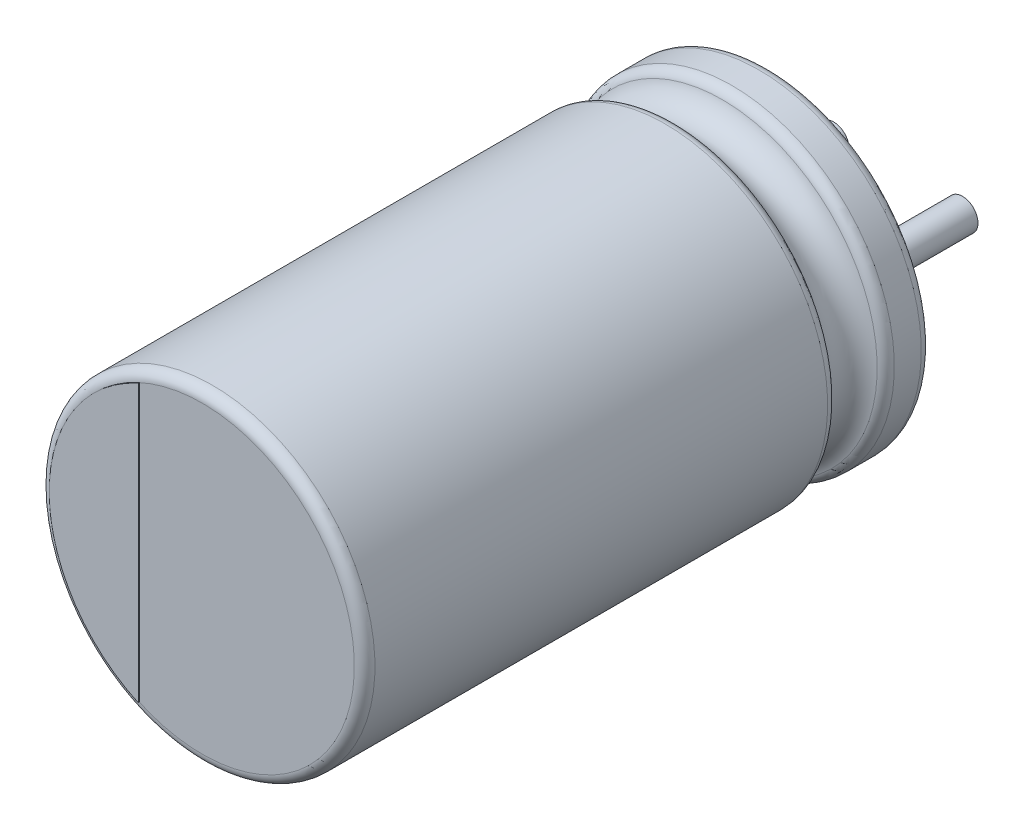
ISO-10303-21;
HEADER;
FILE_DESCRIPTION(('STEP AP214'),'2;1');
FILE_NAME('part.step','',(''),(''),'','','');
FILE_SCHEMA(('AUTOMOTIVE_DESIGN { 1 0 10303 214 1 1 1 1 }'));
ENDSEC;
DATA;
#1=APPLICATION_CONTEXT('core data for automotive mechanical design processes');
#2=APPLICATION_PROTOCOL_DEFINITION('international standard','automotive_design',2000,#1);
#3=PRODUCT_CONTEXT('',#1,'mechanical');
#4=PRODUCT('Part','Part','',(#3));
#5=PRODUCT_RELATED_PRODUCT_CATEGORY('part','',(#4));
#6=PRODUCT_DEFINITION_FORMATION('','',#4);
#7=PRODUCT_DEFINITION_CONTEXT('part definition',#1,'design');
#8=PRODUCT_DEFINITION('design','',#6,#7);
#9=PRODUCT_DEFINITION_SHAPE('','',#8);
#10=(LENGTH_UNIT() NAMED_UNIT(*) SI_UNIT(.MILLI.,.METRE.));
#11=(NAMED_UNIT(*) PLANE_ANGLE_UNIT() SI_UNIT($,.RADIAN.));
#12=(NAMED_UNIT(*) SI_UNIT($,.STERADIAN.) SOLID_ANGLE_UNIT());
#13=UNCERTAINTY_MEASURE_WITH_UNIT(LENGTH_MEASURE(1.E-05),#10,'distance_accuracy_value','');
#14=(GEOMETRIC_REPRESENTATION_CONTEXT(3) GLOBAL_UNCERTAINTY_ASSIGNED_CONTEXT((#13)) GLOBAL_UNIT_ASSIGNED_CONTEXT((#10,
#11,#12)) REPRESENTATION_CONTEXT('',''));
#15=CARTESIAN_POINT('',(0.,0.,0.));
#16=DIRECTION('',(0.,0.,1.));
#17=DIRECTION('',(1.,0.,0.));
#18=AXIS2_PLACEMENT_3D('',#15,#16,#17);
#19=CARTESIAN_POINT('',(0.,0.,11.02));
#20=DIRECTION('',(0.,0.,-1.));
#21=DIRECTION('',(-1.,0.,0.));
#22=AXIS2_PLACEMENT_3D('',#19,#20,#21);
#23=CYLINDRICAL_SURFACE('',#22,2.95);
#24=CARTESIAN_POINT('',(0.,0.,11.));
#25=DIRECTION('',(0.,0.,1.));
#26=DIRECTION('',(1.,0.,0.));
#27=AXIS2_PLACEMENT_3D('',#24,#25,#26);
#28=CIRCLE('',#27,2.95);
#29=CARTESIAN_POINT('',(-1.22242400319062,2.68480531071127,11.));
#30=VERTEX_POINT('',#29);
#31=CARTESIAN_POINT('',(-1.22242400319062,-2.68480531071127,11.));
#32=VERTEX_POINT('',#31);
#33=EDGE_CURVE('E76',#30,#32,#28,.T.);
#34=ORIENTED_EDGE('',*,*,#33,.T.);
#35=DIRECTION('',(0.,0.,-1.));
#36=VECTOR('',#35,1.);
#37=CARTESIAN_POINT('',(-1.22242400319062,-2.68480531071127,11.02));
#38=LINE('',#37,#36);
#39=CARTESIAN_POINT('',(-1.22242400319062,-2.68480531071127,11.02));
#40=VERTEX_POINT('',#39);
#41=EDGE_CURVE('E12',#40,#32,#38,.T.);
#42=ORIENTED_EDGE('',*,*,#41,.F.);
#43=CARTESIAN_POINT('',(0.,0.,11.02));
#44=DIRECTION('',(0.,0.,1.));
#45=DIRECTION('',(1.,0.,0.));
#46=AXIS2_PLACEMENT_3D('',#43,#44,#45);
#47=CIRCLE('',#46,2.95);
#48=CARTESIAN_POINT('',(-1.22242400319062,2.68480531071127,11.02));
#49=VERTEX_POINT('',#48);
#50=EDGE_CURVE('E75',#49,#40,#47,.T.);
#51=ORIENTED_EDGE('',*,*,#50,.F.);
#52=DIRECTION('',(0.,0.,-1.));
#53=VECTOR('',#52,1.);
#54=CARTESIAN_POINT('',(-1.22242400319062,2.68480531071127,11.02));
#55=LINE('',#54,#53);
#56=EDGE_CURVE('E53',#49,#30,#55,.T.);
#57=ORIENTED_EDGE('',*,*,#56,.T.);
#58=EDGE_LOOP('',(#34,#42,#51,#57));
#59=FACE_BOUND('',#58,.T.);
#60=ADVANCED_FACE('F45',(#59),#23,.T.);
#61=CARTESIAN_POINT('',(-1.22242400319062,2.68480531071127,11.02));
#62=DIRECTION('',(-1.,0.,0.));
#63=DIRECTION('',(0.,0.,1.));
#64=AXIS2_PLACEMENT_3D('',#61,#62,#63);
#65=PLANE('',#64);
#66=DIRECTION('',(0.,1.,0.));
#67=VECTOR('',#66,1.);
#68=CARTESIAN_POINT('',(-1.22242400319062,2.68480531071127,11.));
#69=LINE('',#68,#67);
#70=EDGE_CURVE('E68',#32,#30,#69,.T.);
#71=ORIENTED_EDGE('',*,*,#70,.T.);
#72=ORIENTED_EDGE('',*,*,#56,.F.);
#73=DIRECTION('',(0.,1.,0.));
#74=VECTOR('',#73,1.);
#75=CARTESIAN_POINT('',(-1.22242400319062,2.68480531071127,11.02));
#76=LINE('',#75,#74);
#77=EDGE_CURVE('E60',#40,#49,#76,.T.);
#78=ORIENTED_EDGE('',*,*,#77,.F.);
#79=ORIENTED_EDGE('',*,*,#41,.T.);
#80=EDGE_LOOP('',(#71,#72,#78,#79));
#81=FACE_BOUND('',#80,.T.);
#82=ADVANCED_FACE('F71',(#81),#65,.F.);
#83=CARTESIAN_POINT('',(0.,0.,11.02));
#84=DIRECTION('',(0.,0.,1.));
#85=DIRECTION('',(1.,0.,0.));
#86=AXIS2_PLACEMENT_3D('',#83,#84,#85);
#87=PLANE('',#86);
#88=ORIENTED_EDGE('',*,*,#50,.T.);
#89=ORIENTED_EDGE('',*,*,#77,.T.);
#90=EDGE_LOOP('',(#88,#89));
#91=FACE_BOUND('',#90,.T.);
#92=ADVANCED_FACE('F83',(#91),#87,.T.);
#93=CARTESIAN_POINT('',(0.,0.,11.));
#94=DIRECTION('',(0.,0.,1.));
#95=DIRECTION('',(1.,0.,0.));
#96=AXIS2_PLACEMENT_3D('',#93,#94,#95);
#97=PLANE('',#96);
#98=ORIENTED_EDGE('',*,*,#33,.F.);
#99=ORIENTED_EDGE('',*,*,#70,.F.);
#100=EDGE_LOOP('',(#98,#99));
#101=FACE_BOUND('',#100,.T.);
#102=ADVANCED_FACE('F79',(#101),#97,.F.);
#103=CLOSED_SHELL('',(#60,#82,#92,#102));
#104=MANIFOLD_SOLID_BREP('B2',#103);
#105=CARTESIAN_POINT('',(-1.25,0.,-2.5));
#106=DIRECTION('',(0.,0.,1.));
#107=DIRECTION('',(1.,0.,0.));
#108=AXIS2_PLACEMENT_3D('',#105,#106,#107);
#109=CYLINDRICAL_SURFACE('',#108,0.3);
#110=CARTESIAN_POINT('',(-1.25,0.,-2.5));
#111=DIRECTION('',(0.,0.,1.));
#112=DIRECTION('',(-1.,0.,0.));
#113=AXIS2_PLACEMENT_3D('',#110,#111,#112);
#114=CIRCLE('',#113,0.3);
#115=CARTESIAN_POINT('',(-1.55,0.,-2.5));
#116=VERTEX_POINT('',#115);
#117=EDGE_CURVE('E44',#116,#116,#114,.T.);
#118=ORIENTED_EDGE('',*,*,#117,.T.);
#119=EDGE_LOOP('',(#118));
#120=FACE_BOUND('',#119,.T.);
#121=CARTESIAN_POINT('',(-1.25,0.,0.));
#122=DIRECTION('',(0.,0.,1.));
#123=DIRECTION('',(-1.,0.,0.));
#124=AXIS2_PLACEMENT_3D('',#121,#122,#123);
#125=CIRCLE('',#124,0.3);
#126=CARTESIAN_POINT('',(-1.55,0.,0.));
#127=VERTEX_POINT('',#126);
#128=EDGE_CURVE('E127',#127,#127,#125,.T.);
#129=ORIENTED_EDGE('',*,*,#128,.F.);
#130=EDGE_LOOP('',(#129));
#131=FACE_BOUND('',#130,.T.);
#132=ADVANCED_FACE('F124',(#120,#131),#109,.T.);
#133=CARTESIAN_POINT('',(-1.25,0.,-2.5));
#134=DIRECTION('',(0.,0.,-1.));
#135=DIRECTION('',(-1.,0.,0.));
#136=AXIS2_PLACEMENT_3D('',#133,#134,#135);
#137=PLANE('',#136);
#138=ORIENTED_EDGE('',*,*,#117,.F.);
#139=EDGE_LOOP('',(#138));
#140=FACE_BOUND('',#139,.T.);
#141=ADVANCED_FACE('F139',(#140),#137,.T.);
#142=CARTESIAN_POINT('',(-1.25,0.,0.));
#143=DIRECTION('',(0.,0.,-1.));
#144=DIRECTION('',(-1.,0.,0.));
#145=AXIS2_PLACEMENT_3D('',#142,#143,#144);
#146=PLANE('',#145);
#147=ORIENTED_EDGE('',*,*,#128,.T.);
#148=EDGE_LOOP('',(#147));
#149=FACE_BOUND('',#148,.T.);
#150=ADVANCED_FACE('F136',(#149),#146,.F.);
#151=CLOSED_SHELL('',(#132,#141,#150));
#152=MANIFOLD_SOLID_BREP('B6',#151);
#153=CARTESIAN_POINT('',(1.25,0.,-2.5));
#154=DIRECTION('',(0.,0.,1.));
#155=DIRECTION('',(1.,0.,0.));
#156=AXIS2_PLACEMENT_3D('',#153,#154,#155);
#157=CYLINDRICAL_SURFACE('',#156,0.3);
#158=CARTESIAN_POINT('',(1.25,0.,-2.5));
#159=DIRECTION('',(0.,0.,1.));
#160=DIRECTION('',(1.,0.,0.));
#161=AXIS2_PLACEMENT_3D('',#158,#159,#160);
#162=CIRCLE('',#161,0.3);
#163=CARTESIAN_POINT('',(1.55,0.,-2.5));
#164=VERTEX_POINT('',#163);
#165=EDGE_CURVE('E123',#164,#164,#162,.T.);
#166=ORIENTED_EDGE('',*,*,#165,.T.);
#167=EDGE_LOOP('',(#166));
#168=FACE_BOUND('',#167,.T.);
#169=CARTESIAN_POINT('',(1.25,0.,0.));
#170=DIRECTION('',(0.,0.,1.));
#171=DIRECTION('',(1.,0.,0.));
#172=AXIS2_PLACEMENT_3D('',#169,#170,#171);
#173=CIRCLE('',#172,0.3);
#174=CARTESIAN_POINT('',(1.55,0.,0.));
#175=VERTEX_POINT('',#174);
#176=EDGE_CURVE('E174',#175,#175,#173,.T.);
#177=ORIENTED_EDGE('',*,*,#176,.F.);
#178=EDGE_LOOP('',(#177));
#179=FACE_BOUND('',#178,.T.);
#180=ADVANCED_FACE('F171',(#168,#179),#157,.T.);
#181=CARTESIAN_POINT('',(1.25,0.,-2.5));
#182=DIRECTION('',(0.,0.,1.));
#183=DIRECTION('',(1.,0.,0.));
#184=AXIS2_PLACEMENT_3D('',#181,#182,#183);
#185=PLANE('',#184);
#186=ORIENTED_EDGE('',*,*,#165,.F.);
#187=EDGE_LOOP('',(#186));
#188=FACE_BOUND('',#187,.T.);
#189=ADVANCED_FACE('F186',(#188),#185,.F.);
#190=CARTESIAN_POINT('',(1.25,0.,0.));
#191=DIRECTION('',(0.,0.,1.));
#192=DIRECTION('',(1.,0.,0.));
#193=AXIS2_PLACEMENT_3D('',#190,#191,#192);
#194=PLANE('',#193);
#195=ORIENTED_EDGE('',*,*,#176,.T.);
#196=EDGE_LOOP('',(#195));
#197=FACE_BOUND('',#196,.T.);
#198=ADVANCED_FACE('F183',(#197),#194,.T.);
#199=CLOSED_SHELL('',(#180,#189,#198));
#200=MANIFOLD_SOLID_BREP('B39',#199);
#201=CARTESIAN_POINT('',(0.,0.,11.));
#202=DIRECTION('',(0.,0.,1.));
#203=DIRECTION('',(1.,0.,0.));
#204=AXIS2_PLACEMENT_3D('',#201,#202,#203);
#205=PLANE('',#204);
#206=CARTESIAN_POINT('',(0.,0.,11.));
#207=DIRECTION('',(0.,0.,-1.));
#208=DIRECTION('',(-1.,0.,0.));
#209=AXIS2_PLACEMENT_3D('',#206,#207,#208);
#210=CIRCLE('',#209,2.95);
#211=CARTESIAN_POINT('',(-2.95,0.,11.));
#212=VERTEX_POINT('',#211);
#213=EDGE_CURVE('E170',#212,#212,#210,.T.);
#214=ORIENTED_EDGE('',*,*,#213,.F.);
#215=EDGE_LOOP('',(#214));
#216=FACE_BOUND('',#215,.T.);
#217=ADVANCED_FACE('F211',(#216),#205,.T.);
#218=CARTESIAN_POINT('',(0.,0.,10.8));
#219=DIRECTION('',(0.,0.,-1.));
#220=DIRECTION('',(-1.,0.,0.));
#221=AXIS2_PLACEMENT_3D('',#218,#219,#220);
#222=TOROIDAL_SURFACE('',#221,2.95,0.2);
#223=ORIENTED_EDGE('',*,*,#213,.T.);
#224=EDGE_LOOP('',(#223));
#225=FACE_BOUND('',#224,.T.);
#226=CARTESIAN_POINT('',(0.,0.,10.8));
#227=DIRECTION('',(0.,0.,-1.));
#228=DIRECTION('',(-1.,0.,0.));
#229=AXIS2_PLACEMENT_3D('',#226,#227,#228);
#230=CIRCLE('',#229,3.15);
#231=CARTESIAN_POINT('',(-3.15,0.,10.8));
#232=VERTEX_POINT('',#231);
#233=EDGE_CURVE('E217',#232,#232,#230,.T.);
#234=ORIENTED_EDGE('',*,*,#233,.F.);
#235=EDGE_LOOP('',(#234));
#236=FACE_BOUND('',#235,.T.);
#237=ADVANCED_FACE('F259',(#225,#236),#222,.T.);
#238=CARTESIAN_POINT('',(0.,0.,0.));
#239=DIRECTION('',(0.,0.,-1.));
#240=DIRECTION('',(-1.,0.,0.));
#241=AXIS2_PLACEMENT_3D('',#238,#239,#240);
#242=CYLINDRICAL_SURFACE('',#241,3.15);
#243=ORIENTED_EDGE('',*,*,#233,.T.);
#244=EDGE_LOOP('',(#243));
#245=FACE_BOUND('',#244,.T.);
#246=CARTESIAN_POINT('',(0.,0.,2.01727304928868));
#247=DIRECTION('',(0.,0.,-1.));
#248=DIRECTION('',(-1.,0.,0.));
#249=AXIS2_PLACEMENT_3D('',#246,#247,#248);
#250=CIRCLE('',#249,3.15);
#251=CARTESIAN_POINT('',(-3.15,0.,2.01727304928868));
#252=VERTEX_POINT('',#251);
#253=EDGE_CURVE('E221',#252,#252,#250,.T.);
#254=ORIENTED_EDGE('',*,*,#253,.F.);
#255=EDGE_LOOP('',(#254));
#256=FACE_BOUND('',#255,.T.);
#257=ADVANCED_FACE('F264',(#245,#256),#242,.T.);
#258=CARTESIAN_POINT('',(0.,0.,2.01727304928868));
#259=DIRECTION('',(0.,0.,-1.));
#260=DIRECTION('',(-1.,0.,0.));
#261=AXIS2_PLACEMENT_3D('',#258,#259,#260);
#262=TOROIDAL_SURFACE('',#261,2.95,0.2);
#263=ORIENTED_EDGE('',*,*,#253,.T.);
#264=EDGE_LOOP('',(#263));
#265=FACE_BOUND('',#264,.T.);
#266=CARTESIAN_POINT('',(0.,0.,1.82619677081843));
#267=DIRECTION('',(0.,0.,-1.));
#268=DIRECTION('',(-1.,0.,0.));
#269=AXIS2_PLACEMENT_3D('',#266,#267,#268);
#270=CIRCLE('',#269,3.00907500153159);
#271=CARTESIAN_POINT('',(-3.00907500153159,0.,1.82619677081843));
#272=VERTEX_POINT('',#271);
#273=EDGE_CURVE('E225',#272,#272,#270,.T.);
#274=ORIENTED_EDGE('',*,*,#273,.F.);
#275=EDGE_LOOP('',(#274));
#276=FACE_BOUND('',#275,.T.);
#277=ADVANCED_FACE('F268',(#265,#276),#262,.T.);
#278=CARTESIAN_POINT('',(0.,0.,1.37037919057903));
#279=DIRECTION('',(0.,0.,-1.));
#280=DIRECTION('',(-1.,0.,0.));
#281=AXIS2_PLACEMENT_3D('',#278,#279,#280);
#282=TOROIDAL_SURFACE('',#281,3.15,0.477105356969109);
#283=ORIENTED_EDGE('',*,*,#273,.T.);
#284=EDGE_LOOP('',(#283));
#285=FACE_BOUND('',#284,.T.);
#286=CARTESIAN_POINT('',(0.,0.,0.914561610339631));
#287=DIRECTION('',(0.,0.,-1.));
#288=DIRECTION('',(-1.,0.,0.));
#289=AXIS2_PLACEMENT_3D('',#286,#287,#288);
#290=CIRCLE('',#289,3.00907500153159);
#291=CARTESIAN_POINT('',(-3.00907500153159,0.,0.914561610339631));
#292=VERTEX_POINT('',#291);
#293=EDGE_CURVE('E230',#292,#292,#290,.T.);
#294=ORIENTED_EDGE('',*,*,#293,.F.);
#295=EDGE_LOOP('',(#294));
#296=FACE_BOUND('',#295,.T.);
#297=ADVANCED_FACE('F274',(#285,#296),#282,.F.);
#298=CARTESIAN_POINT('',(0.,0.,0.723485331869376));
#299=DIRECTION('',(0.,0.,-1.));
#300=DIRECTION('',(-1.,0.,0.));
#301=AXIS2_PLACEMENT_3D('',#298,#299,#300);
#302=TOROIDAL_SURFACE('',#301,2.95,0.2);
#303=ORIENTED_EDGE('',*,*,#293,.T.);
#304=EDGE_LOOP('',(#303));
#305=FACE_BOUND('',#304,.T.);
#306=CARTESIAN_POINT('',(0.,0.,0.723485331869376));
#307=DIRECTION('',(0.,0.,-1.));
#308=DIRECTION('',(-1.,0.,0.));
#309=AXIS2_PLACEMENT_3D('',#306,#307,#308);
#310=CIRCLE('',#309,3.15);
#311=CARTESIAN_POINT('',(-3.15,0.,0.723485331869376));
#312=VERTEX_POINT('',#311);
#313=EDGE_CURVE('E233',#312,#312,#310,.T.);
#314=ORIENTED_EDGE('',*,*,#313,.F.);
#315=EDGE_LOOP('',(#314));
#316=FACE_BOUND('',#315,.T.);
#317=ADVANCED_FACE('F255',(#305,#316),#302,.T.);
#318=CARTESIAN_POINT('',(0.,0.,0.));
#319=DIRECTION('',(0.,0.,-1.));
#320=DIRECTION('',(-1.,0.,0.));
#321=AXIS2_PLACEMENT_3D('',#318,#319,#320);
#322=CYLINDRICAL_SURFACE('',#321,3.15);
#323=ORIENTED_EDGE('',*,*,#313,.T.);
#324=EDGE_LOOP('',(#323));
#325=FACE_BOUND('',#324,.T.);
#326=CARTESIAN_POINT('',(0.,0.,0.2));
#327=DIRECTION('',(0.,0.,-1.));
#328=DIRECTION('',(-1.,0.,0.));
#329=AXIS2_PLACEMENT_3D('',#326,#327,#328);
#330=CIRCLE('',#329,3.15);
#331=CARTESIAN_POINT('',(-3.15,0.,0.2));
#332=VERTEX_POINT('',#331);
#333=EDGE_CURVE('E236',#332,#332,#330,.T.);
#334=ORIENTED_EDGE('',*,*,#333,.F.);
#335=EDGE_LOOP('',(#334));
#336=FACE_BOUND('',#335,.T.);
#337=ADVANCED_FACE('F247',(#325,#336),#322,.T.);
#338=CARTESIAN_POINT('',(0.,0.,0.2));
#339=DIRECTION('',(0.,0.,-1.));
#340=DIRECTION('',(-1.,0.,0.));
#341=AXIS2_PLACEMENT_3D('',#338,#339,#340);
#342=TOROIDAL_SURFACE('',#341,2.95,0.2);
#343=ORIENTED_EDGE('',*,*,#333,.T.);
#344=EDGE_LOOP('',(#343));
#345=FACE_BOUND('',#344,.T.);
#346=CARTESIAN_POINT('',(0.,0.,0.));
#347=DIRECTION('',(0.,0.,-1.));
#348=DIRECTION('',(-1.,0.,0.));
#349=AXIS2_PLACEMENT_3D('',#346,#347,#348);
#350=CIRCLE('',#349,2.95);
#351=CARTESIAN_POINT('',(-2.95,0.,0.));
#352=VERTEX_POINT('',#351);
#353=EDGE_CURVE('E239',#352,#352,#350,.T.);
#354=ORIENTED_EDGE('',*,*,#353,.F.);
#355=EDGE_LOOP('',(#354));
#356=FACE_BOUND('',#355,.T.);
#357=ADVANCED_FACE('F245',(#345,#356),#342,.T.);
#358=CARTESIAN_POINT('',(0.,0.,0.));
#359=DIRECTION('',(0.,0.,-1.));
#360=DIRECTION('',(-1.,0.,0.));
#361=AXIS2_PLACEMENT_3D('',#358,#359,#360);
#362=PLANE('',#361);
#363=ORIENTED_EDGE('',*,*,#353,.T.);
#364=EDGE_LOOP('',(#363));
#365=FACE_BOUND('',#364,.T.);
#366=ADVANCED_FACE('F243',(#365),#362,.T.);
#367=CLOSED_SHELL('',(#217,#237,#257,#277,#297,#317,#337,#357,#366));
#368=MANIFOLD_SOLID_BREP('B118',#367);
#369=ADVANCED_BREP_SHAPE_REPRESENTATION('',(#18,#104,#152,#200,#368),#14);
#370=SHAPE_DEFINITION_REPRESENTATION(#9,#369);
ENDSEC;
END-ISO-10303-21;
